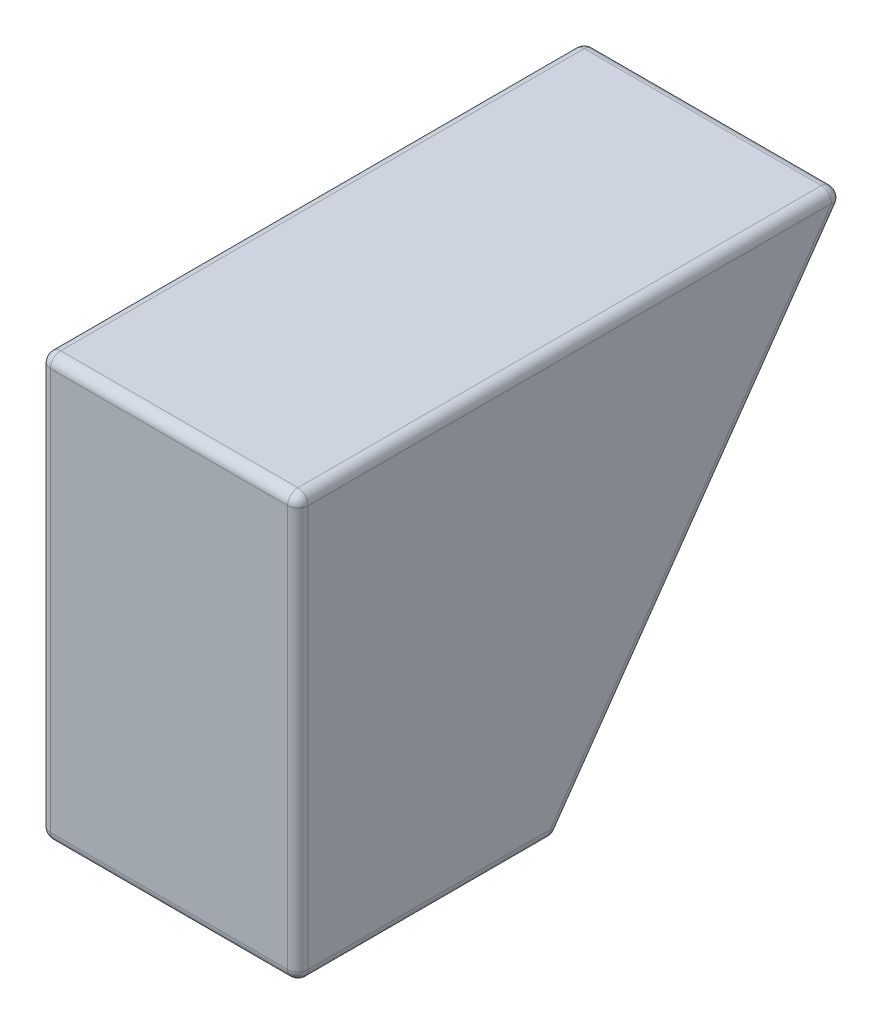
ISO-10303-21;
HEADER;
FILE_DESCRIPTION(('STEP AP214'),'2;1');
FILE_NAME('part.step','',(''),(''),'','','');
FILE_SCHEMA(('AUTOMOTIVE_DESIGN { 1 0 10303 214 1 1 1 1 }'));
ENDSEC;
DATA;
#1=APPLICATION_CONTEXT('core data for automotive mechanical design processes');
#2=APPLICATION_PROTOCOL_DEFINITION('international standard','automotive_design',2000,#1);
#3=PRODUCT_CONTEXT('',#1,'mechanical');
#4=PRODUCT('Part','Part','',(#3));
#5=PRODUCT_RELATED_PRODUCT_CATEGORY('part','',(#4));
#6=PRODUCT_DEFINITION_FORMATION('','',#4);
#7=PRODUCT_DEFINITION_CONTEXT('part definition',#1,'design');
#8=PRODUCT_DEFINITION('design','',#6,#7);
#9=PRODUCT_DEFINITION_SHAPE('','',#8);
#10=(LENGTH_UNIT() NAMED_UNIT(*) SI_UNIT(.MILLI.,.METRE.));
#11=(NAMED_UNIT(*) PLANE_ANGLE_UNIT() SI_UNIT($,.RADIAN.));
#12=(NAMED_UNIT(*) SI_UNIT($,.STERADIAN.) SOLID_ANGLE_UNIT());
#13=UNCERTAINTY_MEASURE_WITH_UNIT(LENGTH_MEASURE(1.E-05),#10,'distance_accuracy_value','');
#14=(GEOMETRIC_REPRESENTATION_CONTEXT(3) GLOBAL_UNCERTAINTY_ASSIGNED_CONTEXT((#13)) GLOBAL_UNIT_ASSIGNED_CONTEXT((#10,
#11,#12)) REPRESENTATION_CONTEXT('',''));
#15=CARTESIAN_POINT('',(0.,0.,0.));
#16=DIRECTION('',(0.,0.,1.));
#17=DIRECTION('',(1.,0.,0.));
#18=AXIS2_PLACEMENT_3D('',#15,#16,#17);
#19=CARTESIAN_POINT('',(12.5,30.,-12.5));
#20=DIRECTION('',(0.,-1.,0.));
#21=DIRECTION('',(0.,0.,-1.));
#22=AXIS2_PLACEMENT_3D('',#19,#20,#21);
#23=CYLINDRICAL_SURFACE('',#22,5.);
#24=CARTESIAN_POINT('',(12.5,1.,-12.5));
#25=DIRECTION('',(0.,1.,0.));
#26=DIRECTION('',(0.,0.,1.));
#27=AXIS2_PLACEMENT_3D('',#24,#25,#26);
#28=CIRCLE('',#27,5.);
#29=CARTESIAN_POINT('',(12.5,1.,-7.5));
#30=VERTEX_POINT('',#29);
#31=EDGE_CURVE('E41',#30,#30,#28,.F.);
#32=ORIENTED_EDGE('',*,*,#31,.T.);
#33=EDGE_LOOP('',(#32));
#34=FACE_BOUND('',#33,.T.);
#35=CARTESIAN_POINT('',(12.5,30.,-12.5));
#36=DIRECTION('',(0.,-1.,0.));
#37=DIRECTION('',(0.,0.,-1.));
#38=AXIS2_PLACEMENT_3D('',#35,#36,#37);
#39=CIRCLE('',#38,5.);
#40=CARTESIAN_POINT('',(12.5,30.,-17.5));
#41=VERTEX_POINT('',#40);
#42=EDGE_CURVE('E219',#41,#41,#39,.T.);
#43=ORIENTED_EDGE('',*,*,#42,.F.);
#44=EDGE_LOOP('',(#43));
#45=FACE_BOUND('',#44,.T.);
#46=DIRECTION('',(0.,-1.,0.));
#47=VECTOR('',#46,1.);
#48=CARTESIAN_POINT('',(16.8301270189222,30.,-15.));
#49=LINE('',#48,#47);
#50=CARTESIAN_POINT('',(16.8301270189222,4.45760221444993,-15.));
#51=VERTEX_POINT('',#50);
#52=CARTESIAN_POINT('',(16.8301270189222,7.45760221444993,-15.));
#53=VERTEX_POINT('',#52);
#54=EDGE_CURVE('E198',#51,#53,#49,.F.);
#55=ORIENTED_EDGE('',*,*,#54,.F.);
#56=CARTESIAN_POINT('',(12.5,4.45760221444993,-12.5));
#57=DIRECTION('',(0.,-1.,0.));
#58=DIRECTION('',(0.,0.,-1.));
#59=AXIS2_PLACEMENT_3D('',#56,#57,#58);
#60=CIRCLE('',#59,5.);
#61=CARTESIAN_POINT('',(8.16987298107781,4.45760221444993,-15.));
#62=VERTEX_POINT('',#61);
#63=EDGE_CURVE('E229',#51,#62,#60,.F.);
#64=ORIENTED_EDGE('',*,*,#63,.T.);
#65=DIRECTION('',(0.,-1.,0.));
#66=VECTOR('',#65,1.);
#67=CARTESIAN_POINT('',(8.16987298107781,30.,-15.));
#68=LINE('',#67,#66);
#69=CARTESIAN_POINT('',(8.16987298107781,7.45760221444993,-15.));
#70=VERTEX_POINT('',#69);
#71=EDGE_CURVE('E225',#70,#62,#68,.T.);
#72=ORIENTED_EDGE('',*,*,#71,.F.);
#73=CARTESIAN_POINT('',(12.5,7.45760221444993,-12.5));
#74=DIRECTION('',(0.,1.,0.));
#75=DIRECTION('',(0.,0.,1.));
#76=AXIS2_PLACEMENT_3D('',#73,#74,#75);
#77=CIRCLE('',#76,5.);
#78=EDGE_CURVE('E227',#70,#53,#77,.F.);
#79=ORIENTED_EDGE('',*,*,#78,.T.);
#80=EDGE_LOOP('',(#55,#64,#72,#79));
#81=FACE_BOUND('',#80,.T.);
#82=ADVANCED_FACE('F33',(#34,#45,#81),#23,.F.);
#83=CARTESIAN_POINT('',(25.,0.,0.));
#84=DIRECTION('',(0.,0.,-1.));
#85=DIRECTION('',(-1.,0.,0.));
#86=AXIS2_PLACEMENT_3D('',#83,#84,#85);
#87=PLANE('',#86);
#88=DIRECTION('',(0.,-1.,0.));
#89=VECTOR('',#88,1.);
#90=CARTESIAN_POINT('',(1.,0.,0.));
#91=LINE('',#90,#89);
#92=CARTESIAN_POINT('',(1.,39.9576022144499,0.));
#93=VERTEX_POINT('',#92);
#94=CARTESIAN_POINT('',(1.,1.,0.));
#95=VERTEX_POINT('',#94);
#96=EDGE_CURVE('E244',#93,#95,#91,.T.);
#97=ORIENTED_EDGE('',*,*,#96,.T.);
#98=DIRECTION('',(-1.,0.,0.));
#99=VECTOR('',#98,1.);
#100=CARTESIAN_POINT('',(25.,1.,0.));
#101=LINE('',#100,#99);
#102=CARTESIAN_POINT('',(24.,1.,0.));
#103=VERTEX_POINT('',#102);
#104=EDGE_CURVE('E248',#95,#103,#101,.F.);
#105=ORIENTED_EDGE('',*,*,#104,.T.);
#106=DIRECTION('',(0.,-1.,0.));
#107=VECTOR('',#106,1.);
#108=CARTESIAN_POINT('',(24.,40.9576022144499,0.));
#109=LINE('',#108,#107);
#110=CARTESIAN_POINT('',(24.,39.9576022144499,0.));
#111=VERTEX_POINT('',#110);
#112=EDGE_CURVE('E246',#103,#111,#109,.F.);
#113=ORIENTED_EDGE('',*,*,#112,.T.);
#114=DIRECTION('',(-1.,0.,0.));
#115=VECTOR('',#114,1.);
#116=CARTESIAN_POINT('',(25.,39.9576022144499,0.));
#117=LINE('',#116,#115);
#118=EDGE_CURVE('E242',#111,#93,#117,.T.);
#119=ORIENTED_EDGE('',*,*,#118,.T.);
#120=EDGE_LOOP('',(#97,#105,#113,#119));
#121=FACE_BOUND('',#120,.T.);
#122=ADVANCED_FACE('F400',(#121),#87,.F.);
#123=CARTESIAN_POINT('',(25.,0.,-25.));
#124=DIRECTION('',(0.,1.,0.));
#125=DIRECTION('',(0.,0.,1.));
#126=AXIS2_PLACEMENT_3D('',#123,#124,#125);
#127=PLANE('',#126);
#128=CARTESIAN_POINT('',(12.5,0.,-12.5));
#129=DIRECTION('',(0.,1.,0.));
#130=DIRECTION('',(0.,0.,1.));
#131=AXIS2_PLACEMENT_3D('',#128,#129,#130);
#132=CIRCLE('',#131,6.);
#133=CARTESIAN_POINT('',(12.5,0.,-6.5));
#134=VERTEX_POINT('',#133);
#135=EDGE_CURVE('E11',#134,#134,#132,.T.);
#136=ORIENTED_EDGE('',*,*,#135,.T.);
#137=EDGE_LOOP('',(#136));
#138=FACE_BOUND('',#137,.T.);
#139=DIRECTION('',(0.,0.,-1.));
#140=VECTOR('',#139,1.);
#141=CARTESIAN_POINT('',(24.,0.,0.));
#142=LINE('',#141,#140);
#143=CARTESIAN_POINT('',(24.,0.,-24.4794329494483));
#144=VERTEX_POINT('',#143);
#145=CARTESIAN_POINT('',(24.,0.,-1.));
#146=VERTEX_POINT('',#145);
#147=EDGE_CURVE('E237',#144,#146,#142,.F.);
#148=ORIENTED_EDGE('',*,*,#147,.T.);
#149=DIRECTION('',(-1.,0.,0.));
#150=VECTOR('',#149,1.);
#151=CARTESIAN_POINT('',(25.,0.,-1.));
#152=LINE('',#151,#150);
#153=CARTESIAN_POINT('',(1.,0.,-1.));
#154=VERTEX_POINT('',#153);
#155=EDGE_CURVE('E239',#146,#154,#152,.T.);
#156=ORIENTED_EDGE('',*,*,#155,.T.);
#157=DIRECTION('',(0.,0.,-1.));
#158=VECTOR('',#157,1.);
#159=CARTESIAN_POINT('',(1.,0.,-25.));
#160=LINE('',#159,#158);
#161=CARTESIAN_POINT('',(1.,0.,-24.4794329494483));
#162=VERTEX_POINT('',#161);
#163=EDGE_CURVE('E233',#154,#162,#160,.T.);
#164=ORIENTED_EDGE('',*,*,#163,.T.);
#165=DIRECTION('',(-1.,0.,0.));
#166=VECTOR('',#165,1.);
#167=CARTESIAN_POINT('',(25.,0.,-24.4794329494483));
#168=LINE('',#167,#166);
#169=EDGE_CURVE('E235',#162,#144,#168,.F.);
#170=ORIENTED_EDGE('',*,*,#169,.T.);
#171=EDGE_LOOP('',(#148,#156,#164,#170));
#172=FACE_BOUND('',#171,.T.);
#173=ADVANCED_FACE('F405',(#138,#172),#127,.F.);
#174=CARTESIAN_POINT('',(25.,40.9576022144499,-53.6788218175518));
#175=DIRECTION('',(0.,0.573576436351036,0.819152044288999));
#176=DIRECTION('',(0.,-0.819152044288999,0.573576436351036));
#177=AXIS2_PLACEMENT_3D('',#174,#175,#176);
#178=PLANE('',#177);
#179=DIRECTION('',(-1.,0.,0.));
#180=VECTOR('',#179,1.);
#181=CARTESIAN_POINT('',(25.,7.88402577809889,-30.5204542812644));
#182=LINE('',#181,#180);
#183=CARTESIAN_POINT('',(21.,7.88402577809889,-30.5204542812644));
#184=VERTEX_POINT('',#183);
#185=CARTESIAN_POINT('',(4.,7.88402577809889,-30.5204542812644));
#186=VERTEX_POINT('',#185);
#187=EDGE_CURVE('E273',#184,#186,#182,.T.);
#188=ORIENTED_EDGE('',*,*,#187,.T.);
#189=DIRECTION('',(0.,-0.819152044288999,0.573576436351036));
#190=VECTOR('',#189,1.);
#191=CARTESIAN_POINT('',(4.,40.9576022144499,-53.6788218175518));
#192=LINE('',#191,#190);
#193=CARTESIAN_POINT('',(4.,2.88402577809889,-27.0194165902159));
#194=VERTEX_POINT('',#193);
#195=EDGE_CURVE('E275',#186,#194,#192,.T.);
#196=ORIENTED_EDGE('',*,*,#195,.T.);
#197=DIRECTION('',(1.,0.,0.));
#198=VECTOR('',#197,1.);
#199=CARTESIAN_POINT('',(25.,2.88402577809889,-27.0194165902159));
#200=LINE('',#199,#198);
#201=CARTESIAN_POINT('',(21.,2.88402577809889,-27.0194165902159));
#202=VERTEX_POINT('',#201);
#203=EDGE_CURVE('E269',#194,#202,#200,.T.);
#204=ORIENTED_EDGE('',*,*,#203,.T.);
#205=DIRECTION('',(0.,0.819152044288999,-0.573576436351036));
#206=VECTOR('',#205,1.);
#207=CARTESIAN_POINT('',(21.,40.9576022144499,-53.6788218175518));
#208=LINE('',#207,#206);
#209=EDGE_CURVE('E271',#202,#184,#208,.T.);
#210=ORIENTED_EDGE('',*,*,#209,.T.);
#211=EDGE_LOOP('',(#188,#196,#204,#210));
#212=FACE_BOUND('',#211,.T.);
#213=DIRECTION('',(0.,0.819152044288999,-0.573576436351036));
#214=VECTOR('',#213,1.);
#215=CARTESIAN_POINT('',(24.,0.,-25.));
#216=LINE('',#215,#214);
#217=CARTESIAN_POINT('',(24.,39.3840257780989,-52.5769917348697));
#218=VERTEX_POINT('',#217);
#219=CARTESIAN_POINT('',(24.,0.426423563648964,-25.2985849937373));
#220=VERTEX_POINT('',#219);
#221=EDGE_CURVE('E264',#218,#220,#216,.F.);
#222=ORIENTED_EDGE('',*,*,#221,.T.);
#223=DIRECTION('',(-1.,0.,0.));
#224=VECTOR('',#223,1.);
#225=CARTESIAN_POINT('',(25.,0.426423563648963,-25.2985849937373));
#226=LINE('',#225,#224);
#227=CARTESIAN_POINT('',(1.,0.426423563648964,-25.2985849937373));
#228=VERTEX_POINT('',#227);
#229=EDGE_CURVE('E266',#220,#228,#226,.T.);
#230=ORIENTED_EDGE('',*,*,#229,.T.);
#231=DIRECTION('',(0.,0.819152044288999,-0.573576436351036));
#232=VECTOR('',#231,1.);
#233=CARTESIAN_POINT('',(1.,40.9576022144499,-53.6788218175518));
#234=LINE('',#233,#232);
#235=CARTESIAN_POINT('',(1.,39.3840257780989,-52.5769917348697));
#236=VERTEX_POINT('',#235);
#237=EDGE_CURVE('E262',#228,#236,#234,.T.);
#238=ORIENTED_EDGE('',*,*,#237,.T.);
#239=DIRECTION('',(-1.,0.,0.));
#240=VECTOR('',#239,1.);
#241=CARTESIAN_POINT('',(25.,39.3840257780989,-52.5769917348697));
#242=LINE('',#241,#240);
#243=EDGE_CURVE('E260',#236,#218,#242,.F.);
#244=ORIENTED_EDGE('',*,*,#243,.T.);
#245=EDGE_LOOP('',(#222,#230,#238,#244));
#246=FACE_BOUND('',#245,.T.);
#247=ADVANCED_FACE('F423',(#212,#246),#178,.F.);
#248=CARTESIAN_POINT('',(25.,40.9576022144499,-25.));
#249=DIRECTION('',(0.,-1.,0.));
#250=DIRECTION('',(0.,0.,-1.));
#251=AXIS2_PLACEMENT_3D('',#248,#249,#250);
#252=PLANE('',#251);
#253=DIRECTION('',(0.,0.,1.));
#254=VECTOR('',#253,1.);
#255=CARTESIAN_POINT('',(24.,40.9576022144499,-53.6788218175518));
#256=LINE('',#255,#254);
#257=CARTESIAN_POINT('',(24.,40.9576022144499,-1.));
#258=VERTEX_POINT('',#257);
#259=CARTESIAN_POINT('',(24.,40.9576022144499,-51.7578396905807));
#260=VERTEX_POINT('',#259);
#261=EDGE_CURVE('E298',#258,#260,#256,.F.);
#262=ORIENTED_EDGE('',*,*,#261,.T.);
#263=DIRECTION('',(-1.,0.,0.));
#264=VECTOR('',#263,1.);
#265=CARTESIAN_POINT('',(25.,40.9576022144499,-51.7578396905807));
#266=LINE('',#265,#264);
#267=CARTESIAN_POINT('',(1.,40.9576022144499,-51.7578396905807));
#268=VERTEX_POINT('',#267);
#269=EDGE_CURVE('E300',#260,#268,#266,.T.);
#270=ORIENTED_EDGE('',*,*,#269,.T.);
#271=DIRECTION('',(0.,0.,1.));
#272=VECTOR('',#271,1.);
#273=CARTESIAN_POINT('',(1.,40.9576022144499,-25.));
#274=LINE('',#273,#272);
#275=CARTESIAN_POINT('',(1.,40.9576022144499,-1.));
#276=VERTEX_POINT('',#275);
#277=EDGE_CURVE('E294',#268,#276,#274,.T.);
#278=ORIENTED_EDGE('',*,*,#277,.T.);
#279=DIRECTION('',(-1.,0.,0.));
#280=VECTOR('',#279,1.);
#281=CARTESIAN_POINT('',(25.,40.9576022144499,-1.));
#282=LINE('',#281,#280);
#283=EDGE_CURVE('E296',#276,#258,#282,.F.);
#284=ORIENTED_EDGE('',*,*,#283,.T.);
#285=EDGE_LOOP('',(#262,#270,#278,#284));
#286=FACE_BOUND('',#285,.T.);
#287=ADVANCED_FACE('F416',(#286),#252,.F.);
#288=CARTESIAN_POINT('',(25.,0.,0.));
#289=DIRECTION('',(1.,0.,0.));
#290=DIRECTION('',(0.,0.,-1.));
#291=AXIS2_PLACEMENT_3D('',#288,#289,#290);
#292=PLANE('',#291);
#293=DIRECTION('',(0.,-1.,0.));
#294=VECTOR('',#293,1.);
#295=CARTESIAN_POINT('',(25.,0.,-1.));
#296=LINE('',#295,#294);
#297=CARTESIAN_POINT('',(25.,39.9576022144499,-1.));
#298=VERTEX_POINT('',#297);
#299=CARTESIAN_POINT('',(25.,1.,-1.));
#300=VERTEX_POINT('',#299);
#301=EDGE_CURVE('E255',#298,#300,#296,.T.);
#302=ORIENTED_EDGE('',*,*,#301,.T.);
#303=DIRECTION('',(0.,0.,-1.));
#304=VECTOR('',#303,1.);
#305=CARTESIAN_POINT('',(25.,1.,-25.));
#306=LINE('',#305,#304);
#307=CARTESIAN_POINT('',(25.,1.,-24.4794329494483));
#308=VERTEX_POINT('',#307);
#309=EDGE_CURVE('E257',#300,#308,#306,.T.);
#310=ORIENTED_EDGE('',*,*,#309,.T.);
#311=DIRECTION('',(0.,0.819152044288999,-0.573576436351036));
#312=VECTOR('',#311,1.);
#313=CARTESIAN_POINT('',(25.,41.531178650801,-52.8596697732628));
#314=LINE('',#313,#312);
#315=CARTESIAN_POINT('',(25.,39.9576022144499,-51.7578396905807));
#316=VERTEX_POINT('',#315);
#317=EDGE_CURVE('E253',#308,#316,#314,.T.);
#318=ORIENTED_EDGE('',*,*,#317,.T.);
#319=DIRECTION('',(0.,0.,1.));
#320=VECTOR('',#319,1.);
#321=CARTESIAN_POINT('',(25.,39.9576022144499,0.));
#322=LINE('',#321,#320);
#323=EDGE_CURVE('E251',#316,#298,#322,.T.);
#324=ORIENTED_EDGE('',*,*,#323,.T.);
#325=EDGE_LOOP('',(#302,#310,#318,#324));
#326=FACE_BOUND('',#325,.T.);
#327=ADVANCED_FACE('F412',(#326),#292,.T.);
#328=CARTESIAN_POINT('',(0.,0.,0.));
#329=DIRECTION('',(1.,0.,0.));
#330=DIRECTION('',(0.,0.,-1.));
#331=AXIS2_PLACEMENT_3D('',#328,#329,#330);
#332=PLANE('',#331);
#333=DIRECTION('',(0.,0.819152044288999,-0.573576436351036));
#334=VECTOR('',#333,1.);
#335=CARTESIAN_POINT('',(0.,-11.1725813234727,-15.9560997472821));
#336=LINE('',#335,#334);
#337=CARTESIAN_POINT('',(0.,39.9576022144499,-51.7578396905807));
#338=VERTEX_POINT('',#337);
#339=CARTESIAN_POINT('',(0.,1.,-24.4794329494483));
#340=VERTEX_POINT('',#339);
#341=EDGE_CURVE('E289',#338,#340,#336,.F.);
#342=ORIENTED_EDGE('',*,*,#341,.T.);
#343=DIRECTION('',(0.,0.,-1.));
#344=VECTOR('',#343,1.);
#345=CARTESIAN_POINT('',(0.,1.,0.));
#346=LINE('',#345,#344);
#347=CARTESIAN_POINT('',(0.,1.,-1.));
#348=VERTEX_POINT('',#347);
#349=EDGE_CURVE('E291',#340,#348,#346,.F.);
#350=ORIENTED_EDGE('',*,*,#349,.T.);
#351=DIRECTION('',(0.,-1.,0.));
#352=VECTOR('',#351,1.);
#353=CARTESIAN_POINT('',(0.,0.,-1.));
#354=LINE('',#353,#352);
#355=CARTESIAN_POINT('',(0.,39.9576022144499,-1.));
#356=VERTEX_POINT('',#355);
#357=EDGE_CURVE('E287',#348,#356,#354,.F.);
#358=ORIENTED_EDGE('',*,*,#357,.T.);
#359=DIRECTION('',(0.,0.,1.));
#360=VECTOR('',#359,1.);
#361=CARTESIAN_POINT('',(0.,39.9576022144499,0.));
#362=LINE('',#361,#360);
#363=EDGE_CURVE('E285',#356,#338,#362,.F.);
#364=ORIENTED_EDGE('',*,*,#363,.T.);
#365=EDGE_LOOP('',(#342,#350,#358,#364));
#366=FACE_BOUND('',#365,.T.);
#367=ADVANCED_FACE('F415',(#366),#332,.F.);
#368=CARTESIAN_POINT('',(12.5,30.,-12.5));
#369=DIRECTION('',(0.,-1.,0.));
#370=DIRECTION('',(0.,0.,-1.));
#371=AXIS2_PLACEMENT_3D('',#368,#369,#370);
#372=PLANE('',#371);
#373=ORIENTED_EDGE('',*,*,#42,.T.);
#374=EDGE_LOOP('',(#373));
#375=FACE_BOUND('',#374,.T.);
#376=ADVANCED_FACE('F410',(#375),#372,.T.);
#377=CARTESIAN_POINT('',(20.,4.45760221444993,-45.));
#378=DIRECTION('',(1.,0.,0.));
#379=DIRECTION('',(0.,0.,-1.));
#380=AXIS2_PLACEMENT_3D('',#377,#378,#379);
#381=PLANE('',#380);
#382=DIRECTION('',(0.,0.,1.));
#383=VECTOR('',#382,1.);
#384=CARTESIAN_POINT('',(20.,7.45760221444993,-45.));
#385=LINE('',#384,#383);
#386=CARTESIAN_POINT('',(20.,7.45760221444993,-29.0010946987657));
#387=VERTEX_POINT('',#386);
#388=CARTESIAN_POINT('',(20.,7.45760221444993,-15.));
#389=VERTEX_POINT('',#388);
#390=EDGE_CURVE('E181',#387,#389,#385,.T.);
#391=ORIENTED_EDGE('',*,*,#390,.F.);
#392=DIRECTION('',(0.,0.819152044288999,-0.573576436351036));
#393=VECTOR('',#392,1.);
#394=CARTESIAN_POINT('',(20.,12.9615986255725,-32.8550344761128));
#395=LINE('',#394,#393);
#396=CARTESIAN_POINT('',(20.,4.27675425873893,-26.773840982278));
#397=VERTEX_POINT('',#396);
#398=EDGE_CURVE('E48',#387,#397,#395,.F.);
#399=ORIENTED_EDGE('',*,*,#398,.T.);
#400=CARTESIAN_POINT('',(20.,3.45760221444993,-26.2002645459269));
#401=DIRECTION('',(1.,0.,0.));
#402=DIRECTION('',(0.,0.,-1.));
#403=AXIS2_PLACEMENT_3D('',#400,#401,#402);
#404=CIRCLE('',#403,1.);
#405=CARTESIAN_POINT('',(20.,4.45760221444993,-26.2002645459269));
#406=VERTEX_POINT('',#405);
#407=EDGE_CURVE('E306',#397,#406,#404,.T.);
#408=ORIENTED_EDGE('',*,*,#407,.T.);
#409=DIRECTION('',(0.,0.,1.));
#410=VECTOR('',#409,1.);
#411=CARTESIAN_POINT('',(20.,4.45760221444993,-45.));
#412=LINE('',#411,#410);
#413=CARTESIAN_POINT('',(20.,4.45760221444993,-15.));
#414=VERTEX_POINT('',#413);
#415=EDGE_CURVE('E204',#406,#414,#412,.T.);
#416=ORIENTED_EDGE('',*,*,#415,.T.);
#417=DIRECTION('',(0.,1.,0.));
#418=VECTOR('',#417,1.);
#419=CARTESIAN_POINT('',(20.,4.45760221444993,-15.));
#420=LINE('',#419,#418);
#421=EDGE_CURVE('E196',#414,#389,#420,.T.);
#422=ORIENTED_EDGE('',*,*,#421,.T.);
#423=EDGE_LOOP('',(#391,#399,#408,#416,#422));
#424=FACE_BOUND('',#423,.T.);
#425=ADVANCED_FACE('F202',(#424),#381,.F.);
#426=CARTESIAN_POINT('',(5.,4.45760221444993,-45.));
#427=DIRECTION('',(-1.,0.,0.));
#428=DIRECTION('',(0.,0.,1.));
#429=AXIS2_PLACEMENT_3D('',#426,#427,#428);
#430=PLANE('',#429);
#431=DIRECTION('',(0.,0.,1.));
#432=VECTOR('',#431,1.);
#433=CARTESIAN_POINT('',(5.,4.45760221444993,-45.));
#434=LINE('',#433,#432);
#435=CARTESIAN_POINT('',(5.,4.45760221444993,-26.2002645459269));
#436=VERTEX_POINT('',#435);
#437=CARTESIAN_POINT('',(5.,4.45760221444993,-15.));
#438=VERTEX_POINT('',#437);
#439=EDGE_CURVE('E220',#436,#438,#434,.T.);
#440=ORIENTED_EDGE('',*,*,#439,.F.);
#441=CARTESIAN_POINT('',(5.,3.45760221444993,-26.2002645459269));
#442=DIRECTION('',(-1.,0.,0.));
#443=DIRECTION('',(0.,0.,1.));
#444=AXIS2_PLACEMENT_3D('',#441,#442,#443);
#445=CIRCLE('',#444,1.);
#446=CARTESIAN_POINT('',(5.,4.27675425873893,-26.773840982278));
#447=VERTEX_POINT('',#446);
#448=EDGE_CURVE('E308',#436,#447,#445,.T.);
#449=ORIENTED_EDGE('',*,*,#448,.T.);
#450=DIRECTION('',(0.,-0.819152044288999,0.573576436351036));
#451=VECTOR('',#450,1.);
#452=CARTESIAN_POINT('',(5.,12.9615986255725,-32.8550344761128));
#453=LINE('',#452,#451);
#454=CARTESIAN_POINT('',(5.,7.45760221444993,-29.0010946987657));
#455=VERTEX_POINT('',#454);
#456=EDGE_CURVE('E278',#447,#455,#453,.F.);
#457=ORIENTED_EDGE('',*,*,#456,.T.);
#458=DIRECTION('',(0.,0.,1.));
#459=VECTOR('',#458,1.);
#460=CARTESIAN_POINT('',(5.,7.45760221444993,-45.));
#461=LINE('',#460,#459);
#462=CARTESIAN_POINT('',(5.,7.45760221444993,-15.));
#463=VERTEX_POINT('',#462);
#464=EDGE_CURVE('E189',#455,#463,#461,.T.);
#465=ORIENTED_EDGE('',*,*,#464,.T.);
#466=DIRECTION('',(0.,-1.,0.));
#467=VECTOR('',#466,1.);
#468=CARTESIAN_POINT('',(5.,4.45760221444993,-15.));
#469=LINE('',#468,#467);
#470=EDGE_CURVE('E199',#463,#438,#469,.T.);
#471=ORIENTED_EDGE('',*,*,#470,.T.);
#472=EDGE_LOOP('',(#440,#449,#457,#465,#471));
#473=FACE_BOUND('',#472,.T.);
#474=ADVANCED_FACE('F539',(#473),#430,.F.);
#475=CARTESIAN_POINT('',(5.,4.45760221444993,-45.));
#476=DIRECTION('',(0.,-1.,0.));
#477=DIRECTION('',(0.,0.,-1.));
#478=AXIS2_PLACEMENT_3D('',#475,#476,#477);
#479=PLANE('',#478);
#480=ORIENTED_EDGE('',*,*,#415,.F.);
#481=DIRECTION('',(1.,0.,0.));
#482=VECTOR('',#481,1.);
#483=CARTESIAN_POINT('',(5.,4.45760221444993,-26.2002645459269));
#484=LINE('',#483,#482);
#485=EDGE_CURVE('E283',#406,#436,#484,.F.);
#486=ORIENTED_EDGE('',*,*,#485,.T.);
#487=ORIENTED_EDGE('',*,*,#439,.T.);
#488=DIRECTION('',(1.,0.,0.));
#489=VECTOR('',#488,1.);
#490=CARTESIAN_POINT('',(5.,4.45760221444993,-15.));
#491=LINE('',#490,#489);
#492=EDGE_CURVE('E190',#438,#62,#491,.T.);
#493=ORIENTED_EDGE('',*,*,#492,.T.);
#494=ORIENTED_EDGE('',*,*,#63,.F.);
#495=EDGE_CURVE('E215',#51,#414,#491,.T.);
#496=ORIENTED_EDGE('',*,*,#495,.T.);
#497=EDGE_LOOP('',(#480,#486,#487,#493,#494,#496));
#498=FACE_BOUND('',#497,.T.);
#499=ADVANCED_FACE('F530',(#498),#479,.F.);
#500=CARTESIAN_POINT('',(5.,7.45760221444993,-45.));
#501=DIRECTION('',(0.,1.,0.));
#502=DIRECTION('',(0.,0.,1.));
#503=AXIS2_PLACEMENT_3D('',#500,#501,#502);
#504=PLANE('',#503);
#505=CARTESIAN_POINT('',(4.,7.45760221444993,-29.0010946987657));
#506=DIRECTION('',(0.,1.,0.));
#507=DIRECTION('',(0.,0.,1.));
#508=AXIS2_PLACEMENT_3D('',#505,#506,#507);
#509=ELLIPSE('',#508,1.22077458876145,1.);
#510=CARTESIAN_POINT('',(4.8191520442928,7.45760221444993,-29.7013022369754));
#511=VERTEX_POINT('',#510);
#512=EDGE_CURVE('E303',#455,#511,#509,.T.);
#513=ORIENTED_EDGE('',*,*,#512,.T.);
#514=DIRECTION('',(-1.,0.,0.));
#515=VECTOR('',#514,1.);
#516=CARTESIAN_POINT('',(5.,7.45760221444993,-29.7013022369754));
#517=LINE('',#516,#515);
#518=CARTESIAN_POINT('',(20.1808479557072,7.45760221444993,-29.7013022369754));
#519=VERTEX_POINT('',#518);
#520=EDGE_CURVE('E56',#511,#519,#517,.F.);
#521=ORIENTED_EDGE('',*,*,#520,.T.);
#522=CARTESIAN_POINT('',(21.,7.45760221444993,-29.0010946987657));
#523=DIRECTION('',(0.,1.,0.));
#524=DIRECTION('',(0.,0.,-1.));
#525=AXIS2_PLACEMENT_3D('',#522,#523,#524);
#526=ELLIPSE('',#525,1.22077458876145,1.);
#527=EDGE_CURVE('E187',#519,#387,#526,.T.);
#528=ORIENTED_EDGE('',*,*,#527,.T.);
#529=ORIENTED_EDGE('',*,*,#390,.T.);
#530=DIRECTION('',(-1.,0.,0.));
#531=VECTOR('',#530,1.);
#532=CARTESIAN_POINT('',(5.,7.45760221444993,-15.));
#533=LINE('',#532,#531);
#534=EDGE_CURVE('E185',#389,#53,#533,.T.);
#535=ORIENTED_EDGE('',*,*,#534,.T.);
#536=ORIENTED_EDGE('',*,*,#78,.F.);
#537=EDGE_CURVE('E200',#70,#463,#533,.T.);
#538=ORIENTED_EDGE('',*,*,#537,.T.);
#539=ORIENTED_EDGE('',*,*,#464,.F.);
#540=EDGE_LOOP('',(#513,#521,#528,#529,#535,#536,#538,#539));
#541=FACE_BOUND('',#540,.T.);
#542=ADVANCED_FACE('F183',(#541),#504,.F.);
#543=CARTESIAN_POINT('',(0.,0.,-15.));
#544=DIRECTION('',(0.,0.,-1.));
#545=DIRECTION('',(-1.,0.,0.));
#546=AXIS2_PLACEMENT_3D('',#543,#544,#545);
#547=PLANE('',#546);
#548=ORIENTED_EDGE('',*,*,#54,.T.);
#549=ORIENTED_EDGE('',*,*,#534,.F.);
#550=ORIENTED_EDGE('',*,*,#421,.F.);
#551=ORIENTED_EDGE('',*,*,#495,.F.);
#552=EDGE_LOOP('',(#548,#549,#550,#551));
#553=FACE_BOUND('',#552,.T.);
#554=ADVANCED_FACE('F194',(#553),#547,.T.);
#555=ORIENTED_EDGE('',*,*,#71,.T.);
#556=ORIENTED_EDGE('',*,*,#492,.F.);
#557=ORIENTED_EDGE('',*,*,#470,.F.);
#558=ORIENTED_EDGE('',*,*,#537,.F.);
#559=EDGE_LOOP('',(#555,#556,#557,#558));
#560=FACE_BOUND('',#559,.T.);
#561=ADVANCED_FACE('F510',(#560),#547,.T.);
#562=CARTESIAN_POINT('',(25.,39.9576022144499,-51.7578396905807));
#563=DIRECTION('',(-1.,0.,0.));
#564=DIRECTION('',(0.,0.,1.));
#565=AXIS2_PLACEMENT_3D('',#562,#563,#564);
#566=CYLINDRICAL_SURFACE('',#565,1.);
#567=CARTESIAN_POINT('',(24.,39.9576022144499,-51.7578396905807));
#568=DIRECTION('',(1.,0.,0.));
#569=DIRECTION('',(0.,0.,-1.));
#570=AXIS2_PLACEMENT_3D('',#567,#568,#569);
#571=CIRCLE('',#570,1.);
#572=EDGE_CURVE('E206',#218,#260,#571,.T.);
#573=ORIENTED_EDGE('',*,*,#572,.F.);
#574=ORIENTED_EDGE('',*,*,#243,.F.);
#575=CARTESIAN_POINT('',(1.,39.9576022144499,-51.7578396905807));
#576=DIRECTION('',(-1.,0.,0.));
#577=DIRECTION('',(0.,0.,1.));
#578=AXIS2_PLACEMENT_3D('',#575,#576,#577);
#579=CIRCLE('',#578,1.);
#580=EDGE_CURVE('E210',#268,#236,#579,.T.);
#581=ORIENTED_EDGE('',*,*,#580,.F.);
#582=ORIENTED_EDGE('',*,*,#269,.F.);
#583=EDGE_LOOP('',(#573,#574,#581,#582));
#584=FACE_BOUND('',#583,.T.);
#585=ADVANCED_FACE('F507',(#584),#566,.T.);
#586=CARTESIAN_POINT('',(24.,39.9576022144499,-51.7578396905807));
#587=DIRECTION('',(0.,0.,1.));
#588=DIRECTION('',(1.,0.,0.));
#589=AXIS2_PLACEMENT_3D('',#586,#587,#588);
#590=SPHERICAL_SURFACE('',#589,1.);
#591=CARTESIAN_POINT('',(24.,39.9576022144499,-51.7578396905807));
#592=DIRECTION('',(0.,0.819152044288996,-0.57357643635104));
#593=DIRECTION('',(0.,0.57357643635104,0.819152044288996));
#594=AXIS2_PLACEMENT_3D('',#591,#592,#593);
#595=CIRCLE('',#594,1.);
#596=EDGE_CURVE('E367',#218,#316,#595,.F.);
#597=ORIENTED_EDGE('',*,*,#596,.F.);
#598=ORIENTED_EDGE('',*,*,#572,.T.);
#599=CARTESIAN_POINT('',(24.,39.9576022144499,-51.7578396905807));
#600=DIRECTION('',(0.,0.,-1.));
#601=DIRECTION('',(-1.,0.,0.));
#602=AXIS2_PLACEMENT_3D('',#599,#600,#601);
#603=CIRCLE('',#602,1.);
#604=EDGE_CURVE('E370',#316,#260,#603,.F.);
#605=ORIENTED_EDGE('',*,*,#604,.F.);
#606=EDGE_LOOP('',(#597,#598,#605));
#607=FACE_BOUND('',#606,.T.);
#608=ADVANCED_FACE('F503',(#607),#590,.T.);
#609=CARTESIAN_POINT('',(1.,39.9576022144499,-51.7578396905807));
#610=DIRECTION('',(0.,0.,1.));
#611=DIRECTION('',(1.,0.,0.));
#612=AXIS2_PLACEMENT_3D('',#609,#610,#611);
#613=SPHERICAL_SURFACE('',#612,1.);
#614=CARTESIAN_POINT('',(1.,39.9576022144499,-51.7578396905807));
#615=DIRECTION('',(0.,0.,-1.));
#616=DIRECTION('',(0.,1.,0.));
#617=AXIS2_PLACEMENT_3D('',#614,#615,#616);
#618=CIRCLE('',#617,1.);
#619=EDGE_CURVE('E361',#268,#338,#618,.F.);
#620=ORIENTED_EDGE('',*,*,#619,.F.);
#621=ORIENTED_EDGE('',*,*,#580,.T.);
#622=CARTESIAN_POINT('',(1.,39.9576022144499,-51.7578396905807));
#623=DIRECTION('',(0.,0.819152044288998,-0.573576436351037));
#624=DIRECTION('',(0.,0.573576436351037,0.819152044288998));
#625=AXIS2_PLACEMENT_3D('',#622,#623,#624);
#626=CIRCLE('',#625,1.);
#627=EDGE_CURVE('E364',#338,#236,#626,.F.);
#628=ORIENTED_EDGE('',*,*,#627,.F.);
#629=EDGE_LOOP('',(#620,#621,#628));
#630=FACE_BOUND('',#629,.T.);
#631=ADVANCED_FACE('F499',(#630),#613,.T.);
#632=CARTESIAN_POINT('',(24.,39.9576022144499,0.));
#633=DIRECTION('',(0.,0.,-1.));
#634=DIRECTION('',(-1.,0.,0.));
#635=AXIS2_PLACEMENT_3D('',#632,#633,#634);
#636=CYLINDRICAL_SURFACE('',#635,1.);
#637=ORIENTED_EDGE('',*,*,#604,.T.);
#638=ORIENTED_EDGE('',*,*,#261,.F.);
#639=CARTESIAN_POINT('',(24.,39.9576022144499,-1.));
#640=DIRECTION('',(0.,0.,1.));
#641=DIRECTION('',(1.,0.,0.));
#642=AXIS2_PLACEMENT_3D('',#639,#640,#641);
#643=CIRCLE('',#642,1.);
#644=EDGE_CURVE('E355',#298,#258,#643,.T.);
#645=ORIENTED_EDGE('',*,*,#644,.F.);
#646=ORIENTED_EDGE('',*,*,#323,.F.);
#647=EDGE_LOOP('',(#637,#638,#645,#646));
#648=FACE_BOUND('',#647,.T.);
#649=ADVANCED_FACE('F495',(#648),#636,.T.);
#650=CARTESIAN_POINT('',(24.,-11.1725813234727,-15.9560997472821));
#651=DIRECTION('',(0.,-0.819152044288999,0.573576436351036));
#652=DIRECTION('',(0.,-0.573576436351036,-0.819152044288999));
#653=AXIS2_PLACEMENT_3D('',#650,#651,#652);
#654=CYLINDRICAL_SURFACE('',#653,1.);
#655=ORIENTED_EDGE('',*,*,#596,.T.);
#656=ORIENTED_EDGE('',*,*,#317,.F.);
#657=CARTESIAN_POINT('',(24.,1.,-24.4794329494483));
#658=DIRECTION('',(0.,-0.819152044288999,0.573576436351036));
#659=DIRECTION('',(0.,-0.573576436351036,-0.819152044288999));
#660=AXIS2_PLACEMENT_3D('',#657,#658,#659);
#661=CIRCLE('',#660,1.);
#662=EDGE_CURVE('E352',#220,#308,#661,.T.);
#663=ORIENTED_EDGE('',*,*,#662,.F.);
#664=ORIENTED_EDGE('',*,*,#221,.F.);
#665=EDGE_LOOP('',(#655,#656,#663,#664));
#666=FACE_BOUND('',#665,.T.);
#667=ADVANCED_FACE('F491',(#666),#654,.T.);
#668=CARTESIAN_POINT('',(25.,1.,-24.4794329494483));
#669=DIRECTION('',(-1.,0.,0.));
#670=DIRECTION('',(0.,0.,1.));
#671=AXIS2_PLACEMENT_3D('',#668,#669,#670);
#672=CYLINDRICAL_SURFACE('',#671,1.);
#673=CARTESIAN_POINT('',(1.,1.,-24.4794329494483));
#674=DIRECTION('',(-1.,0.,0.));
#675=DIRECTION('',(0.,0.,1.));
#676=AXIS2_PLACEMENT_3D('',#673,#674,#675);
#677=CIRCLE('',#676,1.);
#678=EDGE_CURVE('E346',#228,#162,#677,.T.);
#679=ORIENTED_EDGE('',*,*,#678,.F.);
#680=ORIENTED_EDGE('',*,*,#229,.F.);
#681=CARTESIAN_POINT('',(24.,1.,-24.4794329494483));
#682=DIRECTION('',(1.,0.,0.));
#683=DIRECTION('',(0.,0.,-1.));
#684=AXIS2_PLACEMENT_3D('',#681,#682,#683);
#685=CIRCLE('',#684,1.);
#686=EDGE_CURVE('E349',#144,#220,#685,.T.);
#687=ORIENTED_EDGE('',*,*,#686,.F.);
#688=ORIENTED_EDGE('',*,*,#169,.F.);
#689=EDGE_LOOP('',(#679,#680,#687,#688));
#690=FACE_BOUND('',#689,.T.);
#691=ADVANCED_FACE('F487',(#690),#672,.T.);
#692=CARTESIAN_POINT('',(1.,41.531178650801,-52.8596697732628));
#693=DIRECTION('',(0.,0.819152044288999,-0.573576436351036));
#694=DIRECTION('',(0.,0.573576436351036,0.819152044288999));
#695=AXIS2_PLACEMENT_3D('',#692,#693,#694);
#696=CYLINDRICAL_SURFACE('',#695,1.);
#697=ORIENTED_EDGE('',*,*,#627,.T.);
#698=ORIENTED_EDGE('',*,*,#237,.F.);
#699=CARTESIAN_POINT('',(1.,1.,-24.4794329494483));
#700=DIRECTION('',(0.,-0.819152044288998,0.573576436351038));
#701=DIRECTION('',(0.,-0.573576436351038,-0.819152044288998));
#702=AXIS2_PLACEMENT_3D('',#699,#700,#701);
#703=CIRCLE('',#702,1.);
#704=EDGE_CURVE('E344',#340,#228,#703,.T.);
#705=ORIENTED_EDGE('',*,*,#704,.F.);
#706=ORIENTED_EDGE('',*,*,#341,.F.);
#707=EDGE_LOOP('',(#697,#698,#705,#706));
#708=FACE_BOUND('',#707,.T.);
#709=ADVANCED_FACE('F483',(#708),#696,.T.);
#710=CARTESIAN_POINT('',(1.,39.9576022144499,-25.));
#711=DIRECTION('',(0.,0.,1.));
#712=DIRECTION('',(1.,0.,0.));
#713=AXIS2_PLACEMENT_3D('',#710,#711,#712);
#714=CYLINDRICAL_SURFACE('',#713,1.);
#715=ORIENTED_EDGE('',*,*,#619,.T.);
#716=ORIENTED_EDGE('',*,*,#363,.F.);
#717=CARTESIAN_POINT('',(1.,39.9576022144499,-1.));
#718=DIRECTION('',(0.,0.,1.));
#719=DIRECTION('',(1.,0.,0.));
#720=AXIS2_PLACEMENT_3D('',#717,#718,#719);
#721=CIRCLE('',#720,1.);
#722=EDGE_CURVE('E341',#276,#356,#721,.T.);
#723=ORIENTED_EDGE('',*,*,#722,.F.);
#724=ORIENTED_EDGE('',*,*,#277,.F.);
#725=EDGE_LOOP('',(#715,#716,#723,#724));
#726=FACE_BOUND('',#725,.T.);
#727=ADVANCED_FACE('F479',(#726),#714,.T.);
#728=CARTESIAN_POINT('',(25.,39.9576022144499,-1.));
#729=DIRECTION('',(-1.,0.,0.));
#730=DIRECTION('',(0.,0.,1.));
#731=AXIS2_PLACEMENT_3D('',#728,#729,#730);
#732=CYLINDRICAL_SURFACE('',#731,1.);
#733=CARTESIAN_POINT('',(24.,39.9576022144499,-1.));
#734=DIRECTION('',(1.,0.,0.));
#735=DIRECTION('',(0.,0.,-1.));
#736=AXIS2_PLACEMENT_3D('',#733,#734,#735);
#737=CIRCLE('',#736,1.);
#738=EDGE_CURVE('E358',#258,#111,#737,.T.);
#739=ORIENTED_EDGE('',*,*,#738,.F.);
#740=ORIENTED_EDGE('',*,*,#283,.F.);
#741=CARTESIAN_POINT('',(1.,39.9576022144499,-1.));
#742=DIRECTION('',(-1.,0.,0.));
#743=DIRECTION('',(0.,0.,1.));
#744=AXIS2_PLACEMENT_3D('',#741,#742,#743);
#745=CIRCLE('',#744,1.);
#746=EDGE_CURVE('E338',#93,#276,#745,.T.);
#747=ORIENTED_EDGE('',*,*,#746,.F.);
#748=ORIENTED_EDGE('',*,*,#118,.F.);
#749=EDGE_LOOP('',(#739,#740,#747,#748));
#750=FACE_BOUND('',#749,.T.);
#751=ADVANCED_FACE('F475',(#750),#732,.T.);
#752=CARTESIAN_POINT('',(24.,39.9576022144499,-1.));
#753=DIRECTION('',(0.,0.,1.));
#754=DIRECTION('',(1.,0.,0.));
#755=AXIS2_PLACEMENT_3D('',#752,#753,#754);
#756=SPHERICAL_SURFACE('',#755,1.);
#757=ORIENTED_EDGE('',*,*,#644,.T.);
#758=ORIENTED_EDGE('',*,*,#738,.T.);
#759=CARTESIAN_POINT('',(24.,39.9576022144499,-1.));
#760=DIRECTION('',(0.,1.,0.));
#761=DIRECTION('',(0.,0.,1.));
#762=AXIS2_PLACEMENT_3D('',#759,#760,#761);
#763=CIRCLE('',#762,1.);
#764=EDGE_CURVE('E335',#298,#111,#763,.F.);
#765=ORIENTED_EDGE('',*,*,#764,.F.);
#766=EDGE_LOOP('',(#757,#758,#765));
#767=FACE_BOUND('',#766,.T.);
#768=ADVANCED_FACE('F471',(#767),#756,.T.);
#769=CARTESIAN_POINT('',(24.,1.,-24.4794329494483));
#770=DIRECTION('',(0.,0.,1.));
#771=DIRECTION('',(1.,0.,0.));
#772=AXIS2_PLACEMENT_3D('',#769,#770,#771);
#773=SPHERICAL_SURFACE('',#772,1.);
#774=ORIENTED_EDGE('',*,*,#686,.T.);
#775=ORIENTED_EDGE('',*,*,#662,.T.);
#776=CARTESIAN_POINT('',(24.,1.,-24.4794329494483));
#777=DIRECTION('',(0.,0.,-1.));
#778=DIRECTION('',(0.,1.,0.));
#779=AXIS2_PLACEMENT_3D('',#776,#777,#778);
#780=CIRCLE('',#779,1.);
#781=EDGE_CURVE('E333',#144,#308,#780,.F.);
#782=ORIENTED_EDGE('',*,*,#781,.F.);
#783=EDGE_LOOP('',(#774,#775,#782));
#784=FACE_BOUND('',#783,.T.);
#785=ADVANCED_FACE('F467',(#784),#773,.T.);
#786=CARTESIAN_POINT('',(1.,1.,-24.4794329494483));
#787=DIRECTION('',(0.,0.,1.));
#788=DIRECTION('',(1.,0.,0.));
#789=AXIS2_PLACEMENT_3D('',#786,#787,#788);
#790=SPHERICAL_SURFACE('',#789,1.);
#791=ORIENTED_EDGE('',*,*,#704,.T.);
#792=ORIENTED_EDGE('',*,*,#678,.T.);
#793=CARTESIAN_POINT('',(1.,1.,-24.4794329494483));
#794=DIRECTION('',(0.,0.,-1.));
#795=DIRECTION('',(-1.,0.,0.));
#796=AXIS2_PLACEMENT_3D('',#793,#794,#795);
#797=CIRCLE('',#796,1.);
#798=EDGE_CURVE('E330',#340,#162,#797,.F.);
#799=ORIENTED_EDGE('',*,*,#798,.F.);
#800=EDGE_LOOP('',(#791,#792,#799));
#801=FACE_BOUND('',#800,.T.);
#802=ADVANCED_FACE('F463',(#801),#790,.T.);
#803=CARTESIAN_POINT('',(1.,39.9576022144499,-1.));
#804=DIRECTION('',(0.,0.,1.));
#805=DIRECTION('',(1.,0.,0.));
#806=AXIS2_PLACEMENT_3D('',#803,#804,#805);
#807=SPHERICAL_SURFACE('',#806,1.);
#808=ORIENTED_EDGE('',*,*,#746,.T.);
#809=ORIENTED_EDGE('',*,*,#722,.T.);
#810=CARTESIAN_POINT('',(1.,39.9576022144499,-1.));
#811=DIRECTION('',(0.,1.,0.));
#812=DIRECTION('',(0.,0.,1.));
#813=AXIS2_PLACEMENT_3D('',#810,#811,#812);
#814=CIRCLE('',#813,1.);
#815=EDGE_CURVE('E327',#93,#356,#814,.F.);
#816=ORIENTED_EDGE('',*,*,#815,.F.);
#817=EDGE_LOOP('',(#808,#809,#816));
#818=FACE_BOUND('',#817,.T.);
#819=ADVANCED_FACE('F459',(#818),#807,.T.);
#820=CARTESIAN_POINT('',(24.,0.,-1.));
#821=DIRECTION('',(0.,1.,0.));
#822=DIRECTION('',(0.,0.,1.));
#823=AXIS2_PLACEMENT_3D('',#820,#821,#822);
#824=CYLINDRICAL_SURFACE('',#823,1.);
#825=ORIENTED_EDGE('',*,*,#764,.T.);
#826=ORIENTED_EDGE('',*,*,#112,.F.);
#827=CARTESIAN_POINT('',(24.,1.,-1.));
#828=DIRECTION('',(0.,-1.,0.));
#829=DIRECTION('',(0.,0.,-1.));
#830=AXIS2_PLACEMENT_3D('',#827,#828,#829);
#831=CIRCLE('',#830,1.);
#832=EDGE_CURVE('E324',#300,#103,#831,.T.);
#833=ORIENTED_EDGE('',*,*,#832,.F.);
#834=ORIENTED_EDGE('',*,*,#301,.F.);
#835=EDGE_LOOP('',(#825,#826,#833,#834));
#836=FACE_BOUND('',#835,.T.);
#837=ADVANCED_FACE('F455',(#836),#824,.T.);
#838=CARTESIAN_POINT('',(24.,1.,0.));
#839=DIRECTION('',(0.,0.,1.));
#840=DIRECTION('',(0.,-1.,0.));
#841=AXIS2_PLACEMENT_3D('',#838,#839,#840);
#842=CYLINDRICAL_SURFACE('',#841,1.);
#843=ORIENTED_EDGE('',*,*,#781,.T.);
#844=ORIENTED_EDGE('',*,*,#309,.F.);
#845=CARTESIAN_POINT('',(24.,1.,-1.));
#846=DIRECTION('',(0.,0.,1.));
#847=DIRECTION('',(1.,0.,0.));
#848=AXIS2_PLACEMENT_3D('',#845,#846,#847);
#849=CIRCLE('',#848,1.);
#850=EDGE_CURVE('E321',#146,#300,#849,.T.);
#851=ORIENTED_EDGE('',*,*,#850,.F.);
#852=ORIENTED_EDGE('',*,*,#147,.F.);
#853=EDGE_LOOP('',(#843,#844,#851,#852));
#854=FACE_BOUND('',#853,.T.);
#855=ADVANCED_FACE('F451',(#854),#842,.T.);
#856=CARTESIAN_POINT('',(1.,1.,-25.));
#857=DIRECTION('',(0.,0.,-1.));
#858=DIRECTION('',(0.,1.,0.));
#859=AXIS2_PLACEMENT_3D('',#856,#857,#858);
#860=CYLINDRICAL_SURFACE('',#859,1.);
#861=ORIENTED_EDGE('',*,*,#798,.T.);
#862=ORIENTED_EDGE('',*,*,#163,.F.);
#863=CARTESIAN_POINT('',(1.,1.,-1.));
#864=DIRECTION('',(0.,0.,1.));
#865=DIRECTION('',(0.,-1.,0.));
#866=AXIS2_PLACEMENT_3D('',#863,#864,#865);
#867=CIRCLE('',#866,1.);
#868=EDGE_CURVE('E318',#348,#154,#867,.T.);
#869=ORIENTED_EDGE('',*,*,#868,.F.);
#870=ORIENTED_EDGE('',*,*,#349,.F.);
#871=EDGE_LOOP('',(#861,#862,#869,#870));
#872=FACE_BOUND('',#871,.T.);
#873=ADVANCED_FACE('F447',(#872),#860,.T.);
#874=CARTESIAN_POINT('',(1.,0.,-1.));
#875=DIRECTION('',(0.,-1.,0.));
#876=DIRECTION('',(0.,0.,-1.));
#877=AXIS2_PLACEMENT_3D('',#874,#875,#876);
#878=CYLINDRICAL_SURFACE('',#877,1.);
#879=ORIENTED_EDGE('',*,*,#815,.T.);
#880=ORIENTED_EDGE('',*,*,#357,.F.);
#881=CARTESIAN_POINT('',(1.,1.,-1.));
#882=DIRECTION('',(0.,-1.,0.));
#883=DIRECTION('',(0.,0.,-1.));
#884=AXIS2_PLACEMENT_3D('',#881,#882,#883);
#885=CIRCLE('',#884,1.);
#886=EDGE_CURVE('E316',#95,#348,#885,.T.);
#887=ORIENTED_EDGE('',*,*,#886,.F.);
#888=ORIENTED_EDGE('',*,*,#96,.F.);
#889=EDGE_LOOP('',(#879,#880,#887,#888));
#890=FACE_BOUND('',#889,.T.);
#891=ADVANCED_FACE('F443',(#890),#878,.T.);
#892=CARTESIAN_POINT('',(24.,1.,-1.));
#893=DIRECTION('',(0.,0.,1.));
#894=DIRECTION('',(1.,0.,0.));
#895=AXIS2_PLACEMENT_3D('',#892,#893,#894);
#896=SPHERICAL_SURFACE('',#895,1.);
#897=ORIENTED_EDGE('',*,*,#850,.T.);
#898=ORIENTED_EDGE('',*,*,#832,.T.);
#899=CARTESIAN_POINT('',(24.,1.,-1.));
#900=DIRECTION('',(1.,0.,0.));
#901=DIRECTION('',(0.,0.,-1.));
#902=AXIS2_PLACEMENT_3D('',#899,#900,#901);
#903=CIRCLE('',#902,1.);
#904=EDGE_CURVE('E313',#146,#103,#903,.F.);
#905=ORIENTED_EDGE('',*,*,#904,.F.);
#906=EDGE_LOOP('',(#897,#898,#905));
#907=FACE_BOUND('',#906,.T.);
#908=ADVANCED_FACE('F439',(#907),#896,.T.);
#909=CARTESIAN_POINT('',(1.,1.,-1.));
#910=DIRECTION('',(0.,0.,1.));
#911=DIRECTION('',(1.,0.,0.));
#912=AXIS2_PLACEMENT_3D('',#909,#910,#911);
#913=SPHERICAL_SURFACE('',#912,1.);
#914=ORIENTED_EDGE('',*,*,#886,.T.);
#915=ORIENTED_EDGE('',*,*,#868,.T.);
#916=CARTESIAN_POINT('',(1.,1.,-1.));
#917=DIRECTION('',(-1.,0.,0.));
#918=DIRECTION('',(0.,0.,1.));
#919=AXIS2_PLACEMENT_3D('',#916,#917,#918);
#920=CIRCLE('',#919,1.);
#921=EDGE_CURVE('E311',#95,#154,#920,.F.);
#922=ORIENTED_EDGE('',*,*,#921,.F.);
#923=EDGE_LOOP('',(#914,#915,#922));
#924=FACE_BOUND('',#923,.T.);
#925=ADVANCED_FACE('F435',(#924),#913,.T.);
#926=CARTESIAN_POINT('',(25.,1.,-1.));
#927=DIRECTION('',(-1.,0.,0.));
#928=DIRECTION('',(0.,0.,1.));
#929=AXIS2_PLACEMENT_3D('',#926,#927,#928);
#930=CYLINDRICAL_SURFACE('',#929,1.);
#931=ORIENTED_EDGE('',*,*,#904,.T.);
#932=ORIENTED_EDGE('',*,*,#104,.F.);
#933=ORIENTED_EDGE('',*,*,#921,.T.);
#934=ORIENTED_EDGE('',*,*,#155,.F.);
#935=EDGE_LOOP('',(#931,#932,#933,#934));
#936=FACE_BOUND('',#935,.T.);
#937=ADVANCED_FACE('F431',(#936),#930,.T.);
#938=CARTESIAN_POINT('',(21.,41.531178650801,-52.8596697732628));
#939=DIRECTION('',(0.,0.819152044288999,-0.573576436351036));
#940=DIRECTION('',(0.,0.573576436351036,0.819152044288999));
#941=AXIS2_PLACEMENT_3D('',#938,#939,#940);
#942=CYLINDRICAL_SURFACE('',#941,1.);
#943=ORIENTED_EDGE('',*,*,#398,.F.);
#944=ORIENTED_EDGE('',*,*,#527,.F.);
#945=CARTESIAN_POINT('',(21.,8.45760221444992,-29.7013022369754));
#946=DIRECTION('',(-0.707106781186547,0.579227965339574,-0.405579787672632));
#947=DIRECTION('',(-0.707106781186547,-0.579227965339574,0.405579787672632));
#948=AXIS2_PLACEMENT_3D('',#945,#946,#947);
#949=ELLIPSE('',#948,1.41421356237309,1.);
#950=EDGE_CURVE('E314',#184,#519,#949,.T.);
#951=ORIENTED_EDGE('',*,*,#950,.F.);
#952=ORIENTED_EDGE('',*,*,#209,.F.);
#953=CARTESIAN_POINT('',(21.,3.45760221444993,-26.2002645459269));
#954=DIRECTION('',(0.707106781186547,0.579227965339574,-0.405579787672632));
#955=DIRECTION('',(-0.707106781186547,0.579227965339574,-0.405579787672632));
#956=AXIS2_PLACEMENT_3D('',#953,#954,#955);
#957=ELLIPSE('',#956,1.41421356237309,1.);
#958=EDGE_CURVE('E380',#397,#202,#957,.F.);
#959=ORIENTED_EDGE('',*,*,#958,.F.);
#960=EDGE_LOOP('',(#943,#944,#951,#952,#959));
#961=FACE_BOUND('',#960,.T.);
#962=ADVANCED_FACE('F434',(#961),#942,.T.);
#963=CARTESIAN_POINT('',(25.,8.45760221444992,-29.7013022369754));
#964=DIRECTION('',(-1.,0.,0.));
#965=DIRECTION('',(0.,0.,1.));
#966=AXIS2_PLACEMENT_3D('',#963,#964,#965);
#967=CYLINDRICAL_SURFACE('',#966,1.);
#968=ORIENTED_EDGE('',*,*,#520,.F.);
#969=CARTESIAN_POINT('',(4.,8.45760221444992,-29.7013022369754));
#970=DIRECTION('',(-0.707106781186547,-0.579227965339574,0.405579787672632));
#971=DIRECTION('',(0.707106781186547,-0.579227965339574,0.405579787672632));
#972=AXIS2_PLACEMENT_3D('',#969,#970,#971);
#973=ELLIPSE('',#972,1.41421356237309,1.);
#974=EDGE_CURVE('E377',#186,#511,#973,.T.);
#975=ORIENTED_EDGE('',*,*,#974,.F.);
#976=ORIENTED_EDGE('',*,*,#187,.F.);
#977=ORIENTED_EDGE('',*,*,#950,.T.);
#978=EDGE_LOOP('',(#968,#975,#976,#977));
#979=FACE_BOUND('',#978,.T.);
#980=ADVANCED_FACE('F515',(#979),#967,.T.);
#981=CARTESIAN_POINT('',(25.,3.45760221444993,-26.2002645459269));
#982=DIRECTION('',(1.,0.,0.));
#983=DIRECTION('',(0.,0.,-1.));
#984=AXIS2_PLACEMENT_3D('',#981,#982,#983);
#985=CYLINDRICAL_SURFACE('',#984,1.);
#986=ORIENTED_EDGE('',*,*,#958,.T.);
#987=ORIENTED_EDGE('',*,*,#203,.F.);
#988=CARTESIAN_POINT('',(4.,3.45760221444993,-26.2002645459269));
#989=DIRECTION('',(0.707106781186547,-0.579227965339574,0.405579787672632));
#990=DIRECTION('',(-0.707106781186547,-0.579227965339574,0.405579787672632));
#991=AXIS2_PLACEMENT_3D('',#988,#989,#990);
#992=ELLIPSE('',#991,1.41421356237309,1.);
#993=EDGE_CURVE('E375',#447,#194,#992,.F.);
#994=ORIENTED_EDGE('',*,*,#993,.F.);
#995=ORIENTED_EDGE('',*,*,#448,.F.);
#996=ORIENTED_EDGE('',*,*,#485,.F.);
#997=ORIENTED_EDGE('',*,*,#407,.F.);
#998=EDGE_LOOP('',(#986,#987,#994,#995,#996,#997));
#999=FACE_BOUND('',#998,.T.);
#1000=ADVANCED_FACE('F395',(#999),#985,.T.);
#1001=CARTESIAN_POINT('',(4.,41.531178650801,-52.8596697732628));
#1002=DIRECTION('',(0.,-0.819152044288999,0.573576436351036));
#1003=DIRECTION('',(0.,-0.573576436351036,-0.819152044288999));
#1004=AXIS2_PLACEMENT_3D('',#1001,#1002,#1003);
#1005=CYLINDRICAL_SURFACE('',#1004,1.);
#1006=ORIENTED_EDGE('',*,*,#512,.F.);
#1007=ORIENTED_EDGE('',*,*,#456,.F.);
#1008=ORIENTED_EDGE('',*,*,#993,.T.);
#1009=ORIENTED_EDGE('',*,*,#195,.F.);
#1010=ORIENTED_EDGE('',*,*,#974,.T.);
#1011=EDGE_LOOP('',(#1006,#1007,#1008,#1009,#1010));
#1012=FACE_BOUND('',#1011,.T.);
#1013=ADVANCED_FACE('F390',(#1012),#1005,.T.);
#1014=CARTESIAN_POINT('',(12.5,1.,-12.5));
#1015=DIRECTION('',(0.,1.,0.));
#1016=DIRECTION('',(0.,0.,1.));
#1017=AXIS2_PLACEMENT_3D('',#1014,#1015,#1016);
#1018=TOROIDAL_SURFACE('',#1017,6.,1.);
#1019=ORIENTED_EDGE('',*,*,#135,.F.);
#1020=EDGE_LOOP('',(#1019));
#1021=FACE_BOUND('',#1020,.T.);
#1022=ORIENTED_EDGE('',*,*,#31,.F.);
#1023=EDGE_LOOP('',(#1022));
#1024=FACE_BOUND('',#1023,.T.);
#1025=ADVANCED_FACE('F35',(#1021,#1024),#1018,.T.);
#1026=CLOSED_SHELL('',(#82,#122,#173,#247,#287,#327,#367,#376,#425,#474,#499,#542,#554,#561,
#585,#608,#631,#649,#667,#691,#709,#727,#751,#768,#785,#802,#819,#837,#855,#873,#891,#908,#925,
#937,#962,#980,#1000,#1013,#1025));
#1027=MANIFOLD_SOLID_BREP('B2',#1026);
#1028=ADVANCED_BREP_SHAPE_REPRESENTATION('',(#18,#1027),#14);
#1029=SHAPE_DEFINITION_REPRESENTATION(#9,#1028);
ENDSEC;
END-ISO-10303-21;
